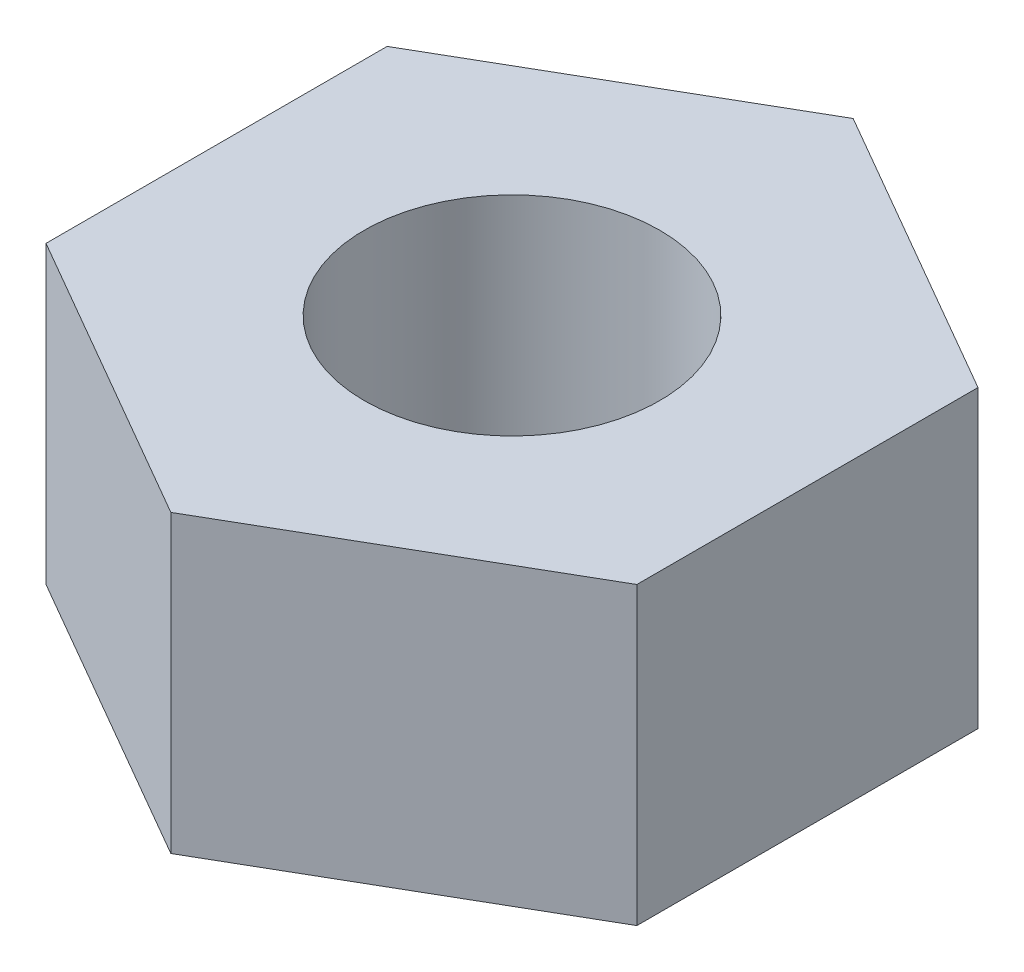
ISO-10303-21;
HEADER;
FILE_DESCRIPTION(('STEP AP214'),'2;1');
FILE_NAME('part.step','',(''),(''),'','','');
FILE_SCHEMA(('AUTOMOTIVE_DESIGN { 1 0 10303 214 1 1 1 1 }'));
ENDSEC;
DATA;
#1=APPLICATION_CONTEXT('core data for automotive mechanical design processes');
#2=APPLICATION_PROTOCOL_DEFINITION('international standard','automotive_design',2000,#1);
#3=PRODUCT_CONTEXT('',#1,'mechanical');
#4=PRODUCT('Part','Part','',(#3));
#5=PRODUCT_RELATED_PRODUCT_CATEGORY('part','',(#4));
#6=PRODUCT_DEFINITION_FORMATION('','',#4);
#7=PRODUCT_DEFINITION_CONTEXT('part definition',#1,'design');
#8=PRODUCT_DEFINITION('design','',#6,#7);
#9=PRODUCT_DEFINITION_SHAPE('','',#8);
#10=(LENGTH_UNIT() NAMED_UNIT(*) SI_UNIT(.MILLI.,.METRE.));
#11=(NAMED_UNIT(*) PLANE_ANGLE_UNIT() SI_UNIT($,.RADIAN.));
#12=(NAMED_UNIT(*) SI_UNIT($,.STERADIAN.) SOLID_ANGLE_UNIT());
#13=UNCERTAINTY_MEASURE_WITH_UNIT(LENGTH_MEASURE(1.E-05),#10,'distance_accuracy_value','');
#14=(GEOMETRIC_REPRESENTATION_CONTEXT(3) GLOBAL_UNCERTAINTY_ASSIGNED_CONTEXT((#13)) GLOBAL_UNIT_ASSIGNED_CONTEXT((#10,
#11,#12)) REPRESENTATION_CONTEXT('',''));
#15=CARTESIAN_POINT('',(0.,0.,0.));
#16=DIRECTION('',(0.,0.,1.));
#17=DIRECTION('',(1.,0.,0.));
#18=AXIS2_PLACEMENT_3D('',#15,#16,#17);
#19=CARTESIAN_POINT('',(0.,3.,0.));
#20=DIRECTION('',(0.,1.,0.));
#21=DIRECTION('',(0.,0.,1.));
#22=AXIS2_PLACEMENT_3D('',#19,#20,#21);
#23=PLANE('',#22);
#24=DIRECTION('',(-0.866025403784439,0.,-0.5));
#25=VECTOR('',#24,1.);
#26=CARTESIAN_POINT('',(3.,3.,-1.73205080756888));
#27=LINE('',#26,#25);
#28=CARTESIAN_POINT('',(3.,3.,-1.73205080756888));
#29=VERTEX_POINT('',#28);
#30=CARTESIAN_POINT('',(0.,3.,-3.46410161513775));
#31=VERTEX_POINT('',#30);
#32=EDGE_CURVE('E129',#29,#31,#27,.T.);
#33=ORIENTED_EDGE('',*,*,#32,.T.);
#34=DIRECTION('',(-0.866025403784438,0.,0.5));
#35=VECTOR('',#34,1.);
#36=CARTESIAN_POINT('',(0.,3.,-3.46410161513775));
#37=LINE('',#36,#35);
#38=CARTESIAN_POINT('',(-3.,3.,-1.73205080756887));
#39=VERTEX_POINT('',#38);
#40=EDGE_CURVE('E87',#31,#39,#37,.T.);
#41=ORIENTED_EDGE('',*,*,#40,.T.);
#42=DIRECTION('',(0.,0.,1.));
#43=VECTOR('',#42,1.);
#44=CARTESIAN_POINT('',(-3.,3.,-1.73205080756887));
#45=LINE('',#44,#43);
#46=CARTESIAN_POINT('',(-3.,3.,1.73205080756888));
#47=VERTEX_POINT('',#46);
#48=EDGE_CURVE('E100',#39,#47,#45,.T.);
#49=ORIENTED_EDGE('',*,*,#48,.T.);
#50=DIRECTION('',(0.866025403784439,0.,0.5));
#51=VECTOR('',#50,1.);
#52=CARTESIAN_POINT('',(-3.,3.,1.73205080756888));
#53=LINE('',#52,#51);
#54=CARTESIAN_POINT('',(0.,3.,3.46410161513775));
#55=VERTEX_POINT('',#54);
#56=EDGE_CURVE('E94',#47,#55,#53,.T.);
#57=ORIENTED_EDGE('',*,*,#56,.T.);
#58=DIRECTION('',(0.866025403784439,0.,-0.5));
#59=VECTOR('',#58,1.);
#60=CARTESIAN_POINT('',(0.,3.,3.46410161513775));
#61=LINE('',#60,#59);
#62=CARTESIAN_POINT('',(3.,3.,1.73205080756888));
#63=VERTEX_POINT('',#62);
#64=EDGE_CURVE('E98',#55,#63,#61,.T.);
#65=ORIENTED_EDGE('',*,*,#64,.T.);
#66=DIRECTION('',(0.,0.,-1.));
#67=VECTOR('',#66,1.);
#68=CARTESIAN_POINT('',(3.,3.,1.73205080756888));
#69=LINE('',#68,#67);
#70=EDGE_CURVE('E50',#63,#29,#69,.T.);
#71=ORIENTED_EDGE('',*,*,#70,.T.);
#72=EDGE_LOOP('',(#33,#41,#49,#57,#65,#71));
#73=FACE_BOUND('',#72,.T.);
#74=CARTESIAN_POINT('',(0.,3.,0.));
#75=DIRECTION('',(0.,1.,0.));
#76=DIRECTION('',(0.,0.,1.));
#77=AXIS2_PLACEMENT_3D('',#74,#75,#76);
#78=CIRCLE('',#77,1.5);
#79=CARTESIAN_POINT('',(0.,3.,1.5));
#80=VERTEX_POINT('',#79);
#81=EDGE_CURVE('E122',#80,#80,#78,.T.);
#82=ORIENTED_EDGE('',*,*,#81,.F.);
#83=EDGE_LOOP('',(#82));
#84=FACE_BOUND('',#83,.T.);
#85=ADVANCED_FACE('F33',(#73,#84),#23,.T.);
#86=CARTESIAN_POINT('',(0.,0.,0.));
#87=DIRECTION('',(0.,1.,0.));
#88=DIRECTION('',(0.,0.,1.));
#89=AXIS2_PLACEMENT_3D('',#86,#87,#88);
#90=PLANE('',#89);
#91=DIRECTION('',(-0.866025403784439,0.,-0.5));
#92=VECTOR('',#91,1.);
#93=CARTESIAN_POINT('',(3.,0.,-1.73205080756888));
#94=LINE('',#93,#92);
#95=CARTESIAN_POINT('',(3.,0.,-1.73205080756888));
#96=VERTEX_POINT('',#95);
#97=CARTESIAN_POINT('',(0.,0.,-3.46410161513775));
#98=VERTEX_POINT('',#97);
#99=EDGE_CURVE('E118',#96,#98,#94,.T.);
#100=ORIENTED_EDGE('',*,*,#99,.F.);
#101=DIRECTION('',(0.,0.,-1.));
#102=VECTOR('',#101,1.);
#103=CARTESIAN_POINT('',(3.,0.,1.73205080756888));
#104=LINE('',#103,#102);
#105=CARTESIAN_POINT('',(3.,0.,1.73205080756888));
#106=VERTEX_POINT('',#105);
#107=EDGE_CURVE('E79',#106,#96,#104,.T.);
#108=ORIENTED_EDGE('',*,*,#107,.F.);
#109=DIRECTION('',(0.866025403784439,0.,-0.5));
#110=VECTOR('',#109,1.);
#111=CARTESIAN_POINT('',(0.,0.,3.46410161513775));
#112=LINE('',#111,#110);
#113=CARTESIAN_POINT('',(0.,0.,3.46410161513775));
#114=VERTEX_POINT('',#113);
#115=EDGE_CURVE('E73',#114,#106,#112,.T.);
#116=ORIENTED_EDGE('',*,*,#115,.F.);
#117=DIRECTION('',(0.866025403784439,0.,0.5));
#118=VECTOR('',#117,1.);
#119=CARTESIAN_POINT('',(-3.,0.,1.73205080756888));
#120=LINE('',#119,#118);
#121=CARTESIAN_POINT('',(-3.,0.,1.73205080756888));
#122=VERTEX_POINT('',#121);
#123=EDGE_CURVE('E108',#122,#114,#120,.T.);
#124=ORIENTED_EDGE('',*,*,#123,.F.);
#125=DIRECTION('',(0.,0.,1.));
#126=VECTOR('',#125,1.);
#127=CARTESIAN_POINT('',(-3.,0.,-1.73205080756887));
#128=LINE('',#127,#126);
#129=CARTESIAN_POINT('',(-3.,0.,-1.73205080756887));
#130=VERTEX_POINT('',#129);
#131=EDGE_CURVE('E124',#130,#122,#128,.T.);
#132=ORIENTED_EDGE('',*,*,#131,.F.);
#133=DIRECTION('',(-0.866025403784438,0.,0.5));
#134=VECTOR('',#133,1.);
#135=CARTESIAN_POINT('',(0.,0.,-3.46410161513775));
#136=LINE('',#135,#134);
#137=EDGE_CURVE('E121',#98,#130,#136,.T.);
#138=ORIENTED_EDGE('',*,*,#137,.F.);
#139=EDGE_LOOP('',(#100,#108,#116,#124,#132,#138));
#140=FACE_BOUND('',#139,.T.);
#141=CARTESIAN_POINT('',(0.,0.,0.));
#142=DIRECTION('',(0.,1.,0.));
#143=DIRECTION('',(0.,0.,1.));
#144=AXIS2_PLACEMENT_3D('',#141,#142,#143);
#145=CIRCLE('',#144,1.5);
#146=CARTESIAN_POINT('',(0.,0.,1.5));
#147=VERTEX_POINT('',#146);
#148=EDGE_CURVE('E222',#147,#147,#145,.T.);
#149=ORIENTED_EDGE('',*,*,#148,.T.);
#150=EDGE_LOOP('',(#149));
#151=FACE_BOUND('',#150,.T.);
#152=ADVANCED_FACE('F138',(#140,#151),#90,.F.);
#153=CARTESIAN_POINT('',(3.,3.,-1.73205080756888));
#154=DIRECTION('',(-0.5,0.,0.866025403784439));
#155=DIRECTION('',(0.866025403784439,0.,0.5));
#156=AXIS2_PLACEMENT_3D('',#153,#154,#155);
#157=PLANE('',#156);
#158=ORIENTED_EDGE('',*,*,#99,.T.);
#159=DIRECTION('',(0.,-1.,0.));
#160=VECTOR('',#159,1.);
#161=CARTESIAN_POINT('',(0.,3.,-3.46410161513775));
#162=LINE('',#161,#160);
#163=EDGE_CURVE('E11',#31,#98,#162,.T.);
#164=ORIENTED_EDGE('',*,*,#163,.F.);
#165=ORIENTED_EDGE('',*,*,#32,.F.);
#166=DIRECTION('',(0.,-1.,0.));
#167=VECTOR('',#166,1.);
#168=CARTESIAN_POINT('',(3.,3.,-1.73205080756888));
#169=LINE('',#168,#167);
#170=EDGE_CURVE('E114',#29,#96,#169,.T.);
#171=ORIENTED_EDGE('',*,*,#170,.T.);
#172=EDGE_LOOP('',(#158,#164,#165,#171));
#173=FACE_BOUND('',#172,.T.);
#174=ADVANCED_FACE('F35',(#173),#157,.F.);
#175=CARTESIAN_POINT('',(0.,3.,-3.46410161513775));
#176=DIRECTION('',(0.500000000000001,0.,0.866025403784438));
#177=DIRECTION('',(0.866025403784438,0.,-0.500000000000001));
#178=AXIS2_PLACEMENT_3D('',#175,#176,#177);
#179=PLANE('',#178);
#180=ORIENTED_EDGE('',*,*,#137,.T.);
#181=DIRECTION('',(0.,-1.,0.));
#182=VECTOR('',#181,1.);
#183=CARTESIAN_POINT('',(-3.,3.,-1.73205080756887));
#184=LINE('',#183,#182);
#185=EDGE_CURVE('E42',#39,#130,#184,.T.);
#186=ORIENTED_EDGE('',*,*,#185,.F.);
#187=ORIENTED_EDGE('',*,*,#40,.F.);
#188=ORIENTED_EDGE('',*,*,#163,.T.);
#189=EDGE_LOOP('',(#180,#186,#187,#188));
#190=FACE_BOUND('',#189,.T.);
#191=ADVANCED_FACE('F163',(#190),#179,.F.);
#192=CARTESIAN_POINT('',(-3.,3.,-1.73205080756887));
#193=DIRECTION('',(1.,0.,0.));
#194=DIRECTION('',(0.,0.,-1.));
#195=AXIS2_PLACEMENT_3D('',#192,#193,#194);
#196=PLANE('',#195);
#197=ORIENTED_EDGE('',*,*,#131,.T.);
#198=DIRECTION('',(0.,-1.,0.));
#199=VECTOR('',#198,1.);
#200=CARTESIAN_POINT('',(-3.,3.,1.73205080756888));
#201=LINE('',#200,#199);
#202=EDGE_CURVE('E109',#47,#122,#201,.T.);
#203=ORIENTED_EDGE('',*,*,#202,.F.);
#204=ORIENTED_EDGE('',*,*,#48,.F.);
#205=ORIENTED_EDGE('',*,*,#185,.T.);
#206=EDGE_LOOP('',(#197,#203,#204,#205));
#207=FACE_BOUND('',#206,.T.);
#208=ADVANCED_FACE('F135',(#207),#196,.F.);
#209=CARTESIAN_POINT('',(-3.,3.,1.73205080756888));
#210=DIRECTION('',(0.5,0.,-0.866025403784439));
#211=DIRECTION('',(-0.866025403784439,0.,-0.5));
#212=AXIS2_PLACEMENT_3D('',#209,#210,#211);
#213=PLANE('',#212);
#214=ORIENTED_EDGE('',*,*,#123,.T.);
#215=DIRECTION('',(0.,-1.,0.));
#216=VECTOR('',#215,1.);
#217=CARTESIAN_POINT('',(0.,3.,3.46410161513775));
#218=LINE('',#217,#216);
#219=EDGE_CURVE('E105',#55,#114,#218,.T.);
#220=ORIENTED_EDGE('',*,*,#219,.F.);
#221=ORIENTED_EDGE('',*,*,#56,.F.);
#222=ORIENTED_EDGE('',*,*,#202,.T.);
#223=EDGE_LOOP('',(#214,#220,#221,#222));
#224=FACE_BOUND('',#223,.T.);
#225=ADVANCED_FACE('F106',(#224),#213,.F.);
#226=CARTESIAN_POINT('',(0.,3.,3.46410161513775));
#227=DIRECTION('',(-0.5,0.,-0.866025403784438));
#228=DIRECTION('',(-0.866025403784439,0.,0.5));
#229=AXIS2_PLACEMENT_3D('',#226,#227,#228);
#230=PLANE('',#229);
#231=ORIENTED_EDGE('',*,*,#115,.T.);
#232=DIRECTION('',(0.,-1.,0.));
#233=VECTOR('',#232,1.);
#234=CARTESIAN_POINT('',(3.,3.,1.73205080756888));
#235=LINE('',#234,#233);
#236=EDGE_CURVE('E110',#63,#106,#235,.T.);
#237=ORIENTED_EDGE('',*,*,#236,.F.);
#238=ORIENTED_EDGE('',*,*,#64,.F.);
#239=ORIENTED_EDGE('',*,*,#219,.T.);
#240=EDGE_LOOP('',(#231,#237,#238,#239));
#241=FACE_BOUND('',#240,.T.);
#242=ADVANCED_FACE('F112',(#241),#230,.F.);
#243=CARTESIAN_POINT('',(3.,3.,1.73205080756888));
#244=DIRECTION('',(-1.,0.,0.));
#245=DIRECTION('',(0.,0.,1.));
#246=AXIS2_PLACEMENT_3D('',#243,#244,#245);
#247=PLANE('',#246);
#248=ORIENTED_EDGE('',*,*,#107,.T.);
#249=ORIENTED_EDGE('',*,*,#170,.F.);
#250=ORIENTED_EDGE('',*,*,#70,.F.);
#251=ORIENTED_EDGE('',*,*,#236,.T.);
#252=EDGE_LOOP('',(#248,#249,#250,#251));
#253=FACE_BOUND('',#252,.T.);
#254=ADVANCED_FACE('F143',(#253),#247,.F.);
#255=CARTESIAN_POINT('',(0.,3.,0.));
#256=DIRECTION('',(0.,-1.,0.));
#257=DIRECTION('',(0.,0.,-1.));
#258=AXIS2_PLACEMENT_3D('',#255,#256,#257);
#259=CYLINDRICAL_SURFACE('',#258,1.5);
#260=ORIENTED_EDGE('',*,*,#81,.T.);
#261=EDGE_LOOP('',(#260));
#262=FACE_BOUND('',#261,.T.);
#263=ORIENTED_EDGE('',*,*,#148,.F.);
#264=EDGE_LOOP('',(#263));
#265=FACE_BOUND('',#264,.T.);
#266=ADVANCED_FACE('F145',(#262,#265),#259,.F.);
#267=CLOSED_SHELL('',(#85,#152,#174,#191,#208,#225,#242,#254,#266));
#268=MANIFOLD_SOLID_BREP('B2',#267);
#269=ADVANCED_BREP_SHAPE_REPRESENTATION('',(#18,#268),#14);
#270=SHAPE_DEFINITION_REPRESENTATION(#9,#269);
ENDSEC;
END-ISO-10303-21;
